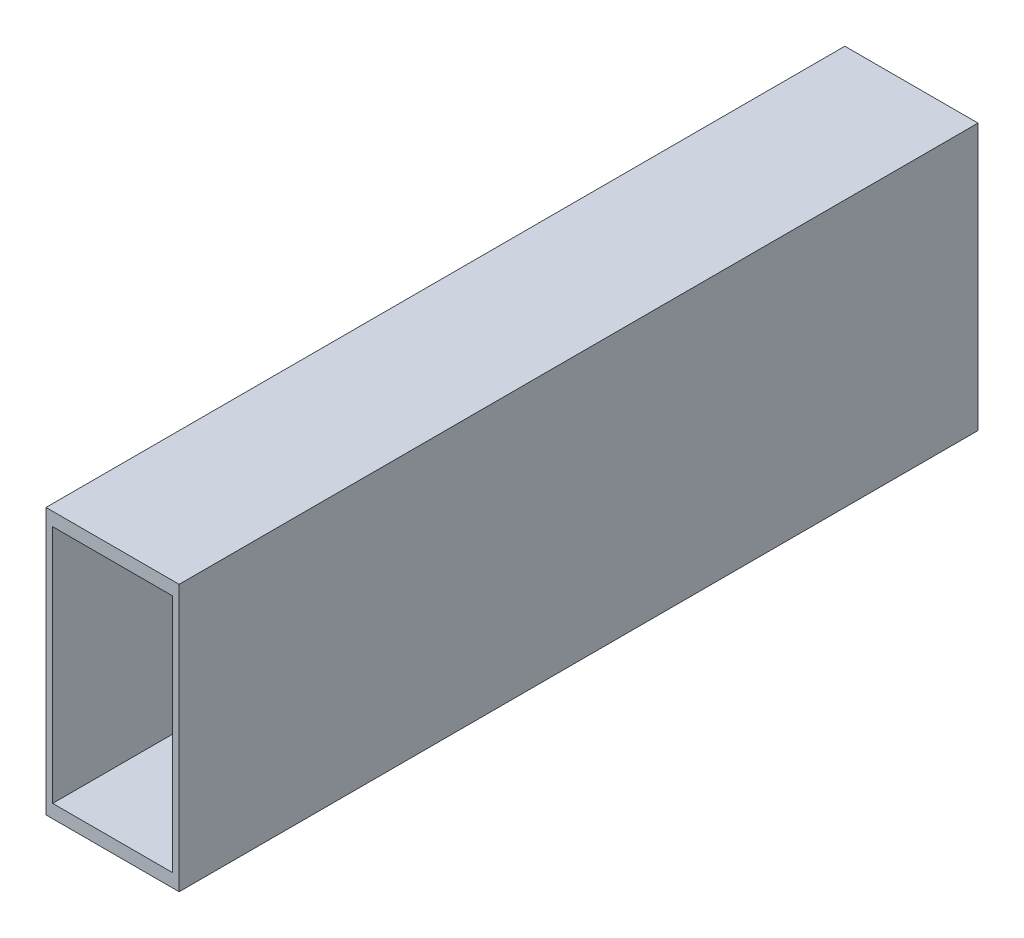
ISO-10303-21;
HEADER;
FILE_DESCRIPTION(('STEP AP214'),'2;1');
FILE_NAME('part.step','',(''),(''),'','','');
FILE_SCHEMA(('AUTOMOTIVE_DESIGN { 1 0 10303 214 1 1 1 1 }'));
ENDSEC;
DATA;
#1=APPLICATION_CONTEXT('core data for automotive mechanical design processes');
#2=APPLICATION_PROTOCOL_DEFINITION('international standard','automotive_design',2000,#1);
#3=PRODUCT_CONTEXT('',#1,'mechanical');
#4=PRODUCT('Part','Part','',(#3));
#5=PRODUCT_RELATED_PRODUCT_CATEGORY('part','',(#4));
#6=PRODUCT_DEFINITION_FORMATION('','',#4);
#7=PRODUCT_DEFINITION_CONTEXT('part definition',#1,'design');
#8=PRODUCT_DEFINITION('design','',#6,#7);
#9=PRODUCT_DEFINITION_SHAPE('','',#8);
#10=(LENGTH_UNIT() NAMED_UNIT(*) SI_UNIT(.MILLI.,.METRE.));
#11=(NAMED_UNIT(*) PLANE_ANGLE_UNIT() SI_UNIT($,.RADIAN.));
#12=(NAMED_UNIT(*) SI_UNIT($,.STERADIAN.) SOLID_ANGLE_UNIT());
#13=UNCERTAINTY_MEASURE_WITH_UNIT(LENGTH_MEASURE(1.E-05),#10,'distance_accuracy_value','');
#14=(GEOMETRIC_REPRESENTATION_CONTEXT(3) GLOBAL_UNCERTAINTY_ASSIGNED_CONTEXT((#13)) GLOBAL_UNIT_ASSIGNED_CONTEXT((#10,
#11,#12)) REPRESENTATION_CONTEXT('',''));
#15=CARTESIAN_POINT('',(0.,0.,0.));
#16=DIRECTION('',(0.,0.,1.));
#17=DIRECTION('',(1.,0.,0.));
#18=AXIS2_PLACEMENT_3D('',#15,#16,#17);
#19=CARTESIAN_POINT('',(0.,0.,1500.));
#20=DIRECTION('',(0.,0.,-1.));
#21=DIRECTION('',(-1.,0.,0.));
#22=AXIS2_PLACEMENT_3D('',#19,#20,#21);
#23=PLANE('',#22);
#24=DIRECTION('',(0.,1.,0.));
#25=VECTOR('',#24,1.);
#26=CARTESIAN_POINT('',(250.,-500.,1500.));
#27=LINE('',#26,#25);
#28=CARTESIAN_POINT('',(250.,-500.,1500.));
#29=VERTEX_POINT('',#28);
#30=CARTESIAN_POINT('',(250.,500.,1500.));
#31=VERTEX_POINT('',#30);
#32=EDGE_CURVE('E153',#29,#31,#27,.T.);
#33=ORIENTED_EDGE('',*,*,#32,.T.);
#34=DIRECTION('',(-1.,0.,0.));
#35=VECTOR('',#34,1.);
#36=CARTESIAN_POINT('',(-250.,500.,1500.));
#37=LINE('',#36,#35);
#38=CARTESIAN_POINT('',(-250.,500.,1500.));
#39=VERTEX_POINT('',#38);
#40=EDGE_CURVE('E157',#31,#39,#37,.T.);
#41=ORIENTED_EDGE('',*,*,#40,.T.);
#42=DIRECTION('',(0.,-1.,0.));
#43=VECTOR('',#42,1.);
#44=CARTESIAN_POINT('',(-250.,-500.,1500.));
#45=LINE('',#44,#43);
#46=CARTESIAN_POINT('',(-250.,-500.,1500.));
#47=VERTEX_POINT('',#46);
#48=EDGE_CURVE('E161',#39,#47,#45,.T.);
#49=ORIENTED_EDGE('',*,*,#48,.T.);
#50=DIRECTION('',(1.,0.,0.));
#51=VECTOR('',#50,1.);
#52=CARTESIAN_POINT('',(-250.,-500.,1500.));
#53=LINE('',#52,#51);
#54=EDGE_CURVE('E164',#47,#29,#53,.T.);
#55=ORIENTED_EDGE('',*,*,#54,.T.);
#56=EDGE_LOOP('',(#33,#41,#49,#55));
#57=FACE_BOUND('',#56,.T.);
#58=DIRECTION('',(0.,1.,0.));
#59=VECTOR('',#58,1.);
#60=CARTESIAN_POINT('',(225.,-450.,1500.));
#61=LINE('',#60,#59);
#62=CARTESIAN_POINT('',(225.,-450.,1500.));
#63=VERTEX_POINT('',#62);
#64=CARTESIAN_POINT('',(225.,450.,1500.));
#65=VERTEX_POINT('',#64);
#66=EDGE_CURVE('E105',#63,#65,#61,.T.);
#67=ORIENTED_EDGE('',*,*,#66,.F.);
#68=DIRECTION('',(1.,0.,0.));
#69=VECTOR('',#68,1.);
#70=CARTESIAN_POINT('',(-225.,-450.,1500.));
#71=LINE('',#70,#69);
#72=CARTESIAN_POINT('',(-225.,-450.,1500.));
#73=VERTEX_POINT('',#72);
#74=EDGE_CURVE('E131',#73,#63,#71,.T.);
#75=ORIENTED_EDGE('',*,*,#74,.F.);
#76=DIRECTION('',(0.,-1.,0.));
#77=VECTOR('',#76,1.);
#78=CARTESIAN_POINT('',(-225.,-450.,1500.));
#79=LINE('',#78,#77);
#80=CARTESIAN_POINT('',(-225.,450.,1500.));
#81=VERTEX_POINT('',#80);
#82=EDGE_CURVE('E127',#81,#73,#79,.T.);
#83=ORIENTED_EDGE('',*,*,#82,.F.);
#84=DIRECTION('',(-1.,0.,0.));
#85=VECTOR('',#84,1.);
#86=CARTESIAN_POINT('',(-225.,450.,1500.));
#87=LINE('',#86,#85);
#88=EDGE_CURVE('E114',#65,#81,#87,.T.);
#89=ORIENTED_EDGE('',*,*,#88,.F.);
#90=EDGE_LOOP('',(#67,#75,#83,#89));
#91=FACE_BOUND('',#90,.T.);
#92=ADVANCED_FACE('F39',(#57,#91),#23,.F.);
#93=CARTESIAN_POINT('',(0.,0.,-1500.));
#94=DIRECTION('',(0.,0.,-1.));
#95=DIRECTION('',(-1.,0.,0.));
#96=AXIS2_PLACEMENT_3D('',#93,#94,#95);
#97=PLANE('',#96);
#98=DIRECTION('',(0.,1.,0.));
#99=VECTOR('',#98,1.);
#100=CARTESIAN_POINT('',(250.,-500.,-1500.));
#101=LINE('',#100,#99);
#102=CARTESIAN_POINT('',(250.,-500.,-1500.));
#103=VERTEX_POINT('',#102);
#104=CARTESIAN_POINT('',(250.,500.,-1500.));
#105=VERTEX_POINT('',#104);
#106=EDGE_CURVE('E123',#103,#105,#101,.T.);
#107=ORIENTED_EDGE('',*,*,#106,.F.);
#108=DIRECTION('',(1.,0.,0.));
#109=VECTOR('',#108,1.);
#110=CARTESIAN_POINT('',(-250.,-500.,-1500.));
#111=LINE('',#110,#109);
#112=CARTESIAN_POINT('',(-250.,-500.,-1500.));
#113=VERTEX_POINT('',#112);
#114=EDGE_CURVE('E158',#113,#103,#111,.T.);
#115=ORIENTED_EDGE('',*,*,#114,.F.);
#116=DIRECTION('',(0.,-1.,0.));
#117=VECTOR('',#116,1.);
#118=CARTESIAN_POINT('',(-250.,-500.,-1500.));
#119=LINE('',#118,#117);
#120=CARTESIAN_POINT('',(-250.,500.,-1500.));
#121=VERTEX_POINT('',#120);
#122=EDGE_CURVE('E174',#121,#113,#119,.T.);
#123=ORIENTED_EDGE('',*,*,#122,.F.);
#124=DIRECTION('',(-1.,0.,0.));
#125=VECTOR('',#124,1.);
#126=CARTESIAN_POINT('',(-250.,500.,-1500.));
#127=LINE('',#126,#125);
#128=EDGE_CURVE('E171',#105,#121,#127,.T.);
#129=ORIENTED_EDGE('',*,*,#128,.F.);
#130=EDGE_LOOP('',(#107,#115,#123,#129));
#131=FACE_BOUND('',#130,.T.);
#132=DIRECTION('',(1.,0.,0.));
#133=VECTOR('',#132,1.);
#134=CARTESIAN_POINT('',(-225.,-450.,-1500.));
#135=LINE('',#134,#133);
#136=CARTESIAN_POINT('',(-225.,-450.,-1500.));
#137=VERTEX_POINT('',#136);
#138=CARTESIAN_POINT('',(225.,-450.,-1500.));
#139=VERTEX_POINT('',#138);
#140=EDGE_CURVE('E115',#137,#139,#135,.T.);
#141=ORIENTED_EDGE('',*,*,#140,.T.);
#142=DIRECTION('',(0.,1.,0.));
#143=VECTOR('',#142,1.);
#144=CARTESIAN_POINT('',(225.,-450.,-1500.));
#145=LINE('',#144,#143);
#146=CARTESIAN_POINT('',(225.,450.,-1500.));
#147=VERTEX_POINT('',#146);
#148=EDGE_CURVE('E63',#139,#147,#145,.T.);
#149=ORIENTED_EDGE('',*,*,#148,.T.);
#150=DIRECTION('',(-1.,0.,0.));
#151=VECTOR('',#150,1.);
#152=CARTESIAN_POINT('',(-225.,450.,-1500.));
#153=LINE('',#152,#151);
#154=CARTESIAN_POINT('',(-225.,450.,-1500.));
#155=VERTEX_POINT('',#154);
#156=EDGE_CURVE('E121',#147,#155,#153,.T.);
#157=ORIENTED_EDGE('',*,*,#156,.T.);
#158=DIRECTION('',(0.,-1.,0.));
#159=VECTOR('',#158,1.);
#160=CARTESIAN_POINT('',(-225.,-450.,-1500.));
#161=LINE('',#160,#159);
#162=EDGE_CURVE('E140',#155,#137,#161,.T.);
#163=ORIENTED_EDGE('',*,*,#162,.T.);
#164=EDGE_LOOP('',(#141,#149,#157,#163));
#165=FACE_BOUND('',#164,.T.);
#166=ADVANCED_FACE('F197',(#131,#165),#97,.T.);
#167=CARTESIAN_POINT('',(250.,-500.,1500.));
#168=DIRECTION('',(-1.,0.,0.));
#169=DIRECTION('',(0.,0.,1.));
#170=AXIS2_PLACEMENT_3D('',#167,#168,#169);
#171=PLANE('',#170);
#172=ORIENTED_EDGE('',*,*,#106,.T.);
#173=DIRECTION('',(0.,0.,-1.));
#174=VECTOR('',#173,1.);
#175=CARTESIAN_POINT('',(250.,500.,1500.));
#176=LINE('',#175,#174);
#177=EDGE_CURVE('E11',#31,#105,#176,.T.);
#178=ORIENTED_EDGE('',*,*,#177,.F.);
#179=ORIENTED_EDGE('',*,*,#32,.F.);
#180=DIRECTION('',(0.,0.,-1.));
#181=VECTOR('',#180,1.);
#182=CARTESIAN_POINT('',(250.,-500.,1500.));
#183=LINE('',#182,#181);
#184=EDGE_CURVE('E167',#29,#103,#183,.T.);
#185=ORIENTED_EDGE('',*,*,#184,.T.);
#186=EDGE_LOOP('',(#172,#178,#179,#185));
#187=FACE_BOUND('',#186,.T.);
#188=ADVANCED_FACE('F41',(#187),#171,.F.);
#189=CARTESIAN_POINT('',(-250.,500.,1500.));
#190=DIRECTION('',(0.,-1.,0.));
#191=DIRECTION('',(1.,0.,0.));
#192=AXIS2_PLACEMENT_3D('',#189,#190,#191);
#193=PLANE('',#192);
#194=ORIENTED_EDGE('',*,*,#128,.T.);
#195=DIRECTION('',(0.,0.,-1.));
#196=VECTOR('',#195,1.);
#197=CARTESIAN_POINT('',(-250.,500.,1500.));
#198=LINE('',#197,#196);
#199=EDGE_CURVE('E48',#39,#121,#198,.T.);
#200=ORIENTED_EDGE('',*,*,#199,.F.);
#201=ORIENTED_EDGE('',*,*,#40,.F.);
#202=ORIENTED_EDGE('',*,*,#177,.T.);
#203=EDGE_LOOP('',(#194,#200,#201,#202));
#204=FACE_BOUND('',#203,.T.);
#205=ADVANCED_FACE('F207',(#204),#193,.F.);
#206=CARTESIAN_POINT('',(-250.,-500.,1500.));
#207=DIRECTION('',(1.,0.,0.));
#208=DIRECTION('',(0.,0.,-1.));
#209=AXIS2_PLACEMENT_3D('',#206,#207,#208);
#210=PLANE('',#209);
#211=ORIENTED_EDGE('',*,*,#122,.T.);
#212=DIRECTION('',(0.,0.,-1.));
#213=VECTOR('',#212,1.);
#214=CARTESIAN_POINT('',(-250.,-500.,1500.));
#215=LINE('',#214,#213);
#216=EDGE_CURVE('E182',#47,#113,#215,.T.);
#217=ORIENTED_EDGE('',*,*,#216,.F.);
#218=ORIENTED_EDGE('',*,*,#48,.F.);
#219=ORIENTED_EDGE('',*,*,#199,.T.);
#220=EDGE_LOOP('',(#211,#217,#218,#219));
#221=FACE_BOUND('',#220,.T.);
#222=ADVANCED_FACE('F191',(#221),#210,.F.);
#223=CARTESIAN_POINT('',(-250.,-500.,1500.));
#224=DIRECTION('',(0.,1.,0.));
#225=DIRECTION('',(0.,0.,1.));
#226=AXIS2_PLACEMENT_3D('',#223,#224,#225);
#227=PLANE('',#226);
#228=ORIENTED_EDGE('',*,*,#114,.T.);
#229=ORIENTED_EDGE('',*,*,#184,.F.);
#230=ORIENTED_EDGE('',*,*,#54,.F.);
#231=ORIENTED_EDGE('',*,*,#216,.T.);
#232=EDGE_LOOP('',(#228,#229,#230,#231));
#233=FACE_BOUND('',#232,.T.);
#234=ADVANCED_FACE('F201',(#233),#227,.F.);
#235=CARTESIAN_POINT('',(225.,-450.,1500.));
#236=DIRECTION('',(-1.,0.,0.));
#237=DIRECTION('',(0.,0.,1.));
#238=AXIS2_PLACEMENT_3D('',#235,#236,#237);
#239=PLANE('',#238);
#240=ORIENTED_EDGE('',*,*,#148,.F.);
#241=DIRECTION('',(0.,0.,-1.));
#242=VECTOR('',#241,1.);
#243=CARTESIAN_POINT('',(225.,-450.,1500.));
#244=LINE('',#243,#242);
#245=EDGE_CURVE('E109',#63,#139,#244,.T.);
#246=ORIENTED_EDGE('',*,*,#245,.F.);
#247=ORIENTED_EDGE('',*,*,#66,.T.);
#248=DIRECTION('',(0.,0.,-1.));
#249=VECTOR('',#248,1.);
#250=CARTESIAN_POINT('',(225.,450.,1500.));
#251=LINE('',#250,#249);
#252=EDGE_CURVE('E108',#65,#147,#251,.T.);
#253=ORIENTED_EDGE('',*,*,#252,.T.);
#254=EDGE_LOOP('',(#240,#246,#247,#253));
#255=FACE_BOUND('',#254,.T.);
#256=ADVANCED_FACE('F107',(#255),#239,.T.);
#257=CARTESIAN_POINT('',(-225.,450.,1500.));
#258=DIRECTION('',(0.,-1.,0.));
#259=DIRECTION('',(0.,0.,-1.));
#260=AXIS2_PLACEMENT_3D('',#257,#258,#259);
#261=PLANE('',#260);
#262=ORIENTED_EDGE('',*,*,#156,.F.);
#263=ORIENTED_EDGE('',*,*,#252,.F.);
#264=ORIENTED_EDGE('',*,*,#88,.T.);
#265=DIRECTION('',(0.,0.,-1.));
#266=VECTOR('',#265,1.);
#267=CARTESIAN_POINT('',(-225.,450.,1500.));
#268=LINE('',#267,#266);
#269=EDGE_CURVE('E124',#81,#155,#268,.T.);
#270=ORIENTED_EDGE('',*,*,#269,.T.);
#271=EDGE_LOOP('',(#262,#263,#264,#270));
#272=FACE_BOUND('',#271,.T.);
#273=ADVANCED_FACE('F118',(#272),#261,.T.);
#274=CARTESIAN_POINT('',(-225.,-450.,1500.));
#275=DIRECTION('',(1.,0.,0.));
#276=DIRECTION('',(0.,0.,-1.));
#277=AXIS2_PLACEMENT_3D('',#274,#275,#276);
#278=PLANE('',#277);
#279=ORIENTED_EDGE('',*,*,#162,.F.);
#280=ORIENTED_EDGE('',*,*,#269,.F.);
#281=ORIENTED_EDGE('',*,*,#82,.T.);
#282=DIRECTION('',(0.,0.,-1.));
#283=VECTOR('',#282,1.);
#284=CARTESIAN_POINT('',(-225.,-450.,1500.));
#285=LINE('',#284,#283);
#286=EDGE_CURVE('E55',#73,#137,#285,.T.);
#287=ORIENTED_EDGE('',*,*,#286,.T.);
#288=EDGE_LOOP('',(#279,#280,#281,#287));
#289=FACE_BOUND('',#288,.T.);
#290=ADVANCED_FACE('F230',(#289),#278,.T.);
#291=CARTESIAN_POINT('',(-225.,-450.,1500.));
#292=DIRECTION('',(0.,1.,0.));
#293=DIRECTION('',(0.,0.,1.));
#294=AXIS2_PLACEMENT_3D('',#291,#292,#293);
#295=PLANE('',#294);
#296=ORIENTED_EDGE('',*,*,#140,.F.);
#297=ORIENTED_EDGE('',*,*,#286,.F.);
#298=ORIENTED_EDGE('',*,*,#74,.T.);
#299=ORIENTED_EDGE('',*,*,#245,.T.);
#300=EDGE_LOOP('',(#296,#297,#298,#299));
#301=FACE_BOUND('',#300,.T.);
#302=ADVANCED_FACE('F234',(#301),#295,.T.);
#303=CLOSED_SHELL('',(#92,#166,#188,#205,#222,#234,#256,#273,#290,#302));
#304=MANIFOLD_SOLID_BREP('B2',#303);
#305=ADVANCED_BREP_SHAPE_REPRESENTATION('',(#18,#304),#14);
#306=SHAPE_DEFINITION_REPRESENTATION(#9,#305);
ENDSEC;
END-ISO-10303-21;
